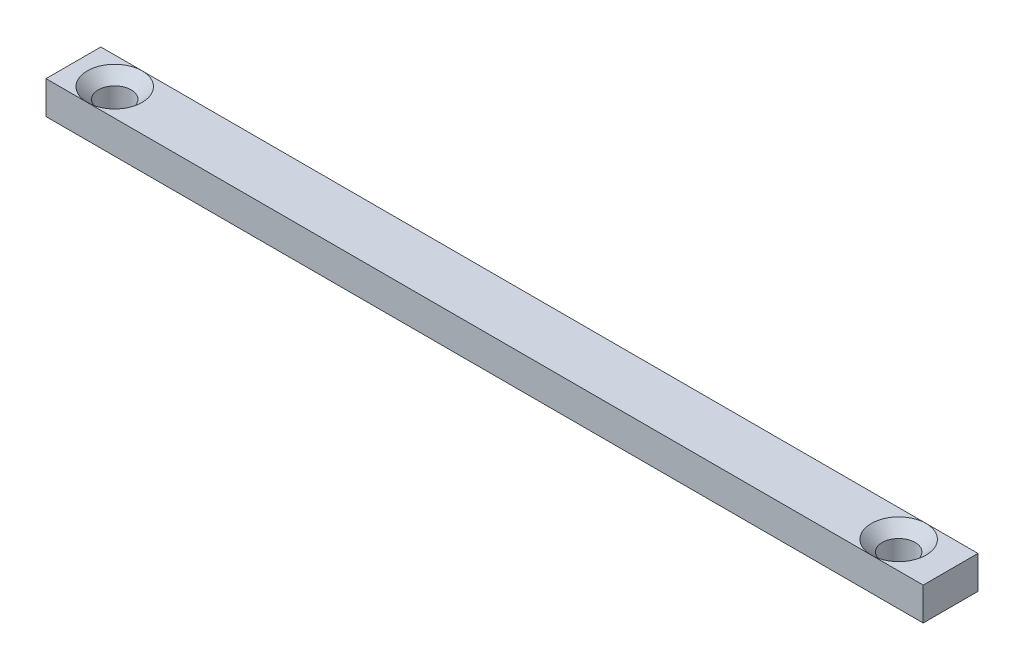
ISO-10303-21;
HEADER;
FILE_DESCRIPTION(('STEP AP214'),'2;1');
FILE_NAME('part.step','',(''),(''),'','','');
FILE_SCHEMA(('AUTOMOTIVE_DESIGN { 1 0 10303 214 1 1 1 1 }'));
ENDSEC;
DATA;
#1=APPLICATION_CONTEXT('core data for automotive mechanical design processes');
#2=APPLICATION_PROTOCOL_DEFINITION('international standard','automotive_design',2000,#1);
#3=PRODUCT_CONTEXT('',#1,'mechanical');
#4=PRODUCT('Part','Part','',(#3));
#5=PRODUCT_RELATED_PRODUCT_CATEGORY('part','',(#4));
#6=PRODUCT_DEFINITION_FORMATION('','',#4);
#7=PRODUCT_DEFINITION_CONTEXT('part definition',#1,'design');
#8=PRODUCT_DEFINITION('design','',#6,#7);
#9=PRODUCT_DEFINITION_SHAPE('','',#8);
#10=(LENGTH_UNIT() NAMED_UNIT(*) SI_UNIT(.MILLI.,.METRE.));
#11=(NAMED_UNIT(*) PLANE_ANGLE_UNIT() SI_UNIT($,.RADIAN.));
#12=(NAMED_UNIT(*) SI_UNIT($,.STERADIAN.) SOLID_ANGLE_UNIT());
#13=UNCERTAINTY_MEASURE_WITH_UNIT(LENGTH_MEASURE(1.E-05),#10,'distance_accuracy_value','');
#14=(GEOMETRIC_REPRESENTATION_CONTEXT(3) GLOBAL_UNCERTAINTY_ASSIGNED_CONTEXT((#13)) GLOBAL_UNIT_ASSIGNED_CONTEXT((#10,
#11,#12)) REPRESENTATION_CONTEXT('',''));
#15=CARTESIAN_POINT('',(0.,0.,0.));
#16=DIRECTION('',(0.,0.,1.));
#17=DIRECTION('',(1.,0.,0.));
#18=AXIS2_PLACEMENT_3D('',#15,#16,#17);
#19=CARTESIAN_POINT('',(0.,3.,0.));
#20=DIRECTION('',(0.,1.,0.));
#21=DIRECTION('',(0.,0.,1.));
#22=AXIS2_PLACEMENT_3D('',#19,#20,#21);
#23=PLANE('',#22);
#24=DIRECTION('',(1.,0.,0.));
#25=VECTOR('',#24,1.);
#26=CARTESIAN_POINT('',(-31.9743377483444,3.,-2.4192880794702));
#27=LINE('',#26,#25);
#28=CARTESIAN_POINT('',(-28.2081632060605,3.,-2.4192880794702));
#29=VERTEX_POINT('',#28);
#30=CARTESIAN_POINT('',(43.2918367939395,3.,-2.4192880794702));
#31=VERTEX_POINT('',#30);
#32=EDGE_CURVE('E117',#29,#31,#27,.T.);
#33=ORIENTED_EDGE('',*,*,#32,.T.);
#34=CARTESIAN_POINT('',(43.2918367939395,3.,-4.91928807947026));
#35=DIRECTION('',(0.,1.,0.));
#36=DIRECTION('',(0.,0.,1.));
#37=AXIS2_PLACEMENT_3D('',#34,#35,#36);
#38=CIRCLE('',#37,2.50000000000002);
#39=CARTESIAN_POINT('',(43.2918367939395,3.,-7.4192880794702));
#40=VERTEX_POINT('',#39);
#41=EDGE_CURVE('E63',#31,#40,#38,.F.);
#42=ORIENTED_EDGE('',*,*,#41,.T.);
#43=DIRECTION('',(-1.,0.,0.));
#44=VECTOR('',#43,1.);
#45=CARTESIAN_POINT('',(-31.9743377483444,3.,-7.4192880794702));
#46=LINE('',#45,#44);
#47=CARTESIAN_POINT('',(-28.2081632060605,3.,-7.4192880794702));
#48=VERTEX_POINT('',#47);
#49=EDGE_CURVE('E160',#40,#48,#46,.T.);
#50=ORIENTED_EDGE('',*,*,#49,.T.);
#51=CARTESIAN_POINT('',(-28.2081632060605,3.,-4.9192880794702));
#52=DIRECTION('',(0.,1.,0.));
#53=DIRECTION('',(0.,0.,1.));
#54=AXIS2_PLACEMENT_3D('',#51,#52,#53);
#55=CIRCLE('',#54,2.50000000000002);
#56=EDGE_CURVE('E69',#48,#29,#55,.F.);
#57=ORIENTED_EDGE('',*,*,#56,.T.);
#58=EDGE_LOOP('',(#33,#42,#50,#57));
#59=FACE_BOUND('',#58,.T.);
#60=ADVANCED_FACE('F53',(#59),#23,.T.);
#61=CARTESIAN_POINT('',(-31.9743377483444,3.,-2.4192880794702));
#62=VERTEX_POINT('',#61);
#63=EDGE_CURVE('E109',#62,#29,#27,.T.);
#64=ORIENTED_EDGE('',*,*,#63,.T.);
#65=CARTESIAN_POINT('',(-28.2081632060605,3.,-4.9192880794702));
#66=DIRECTION('',(0.,1.,0.));
#67=DIRECTION('',(0.,0.,1.));
#68=AXIS2_PLACEMENT_3D('',#65,#66,#67);
#69=CIRCLE('',#68,2.50000000000002);
#70=EDGE_CURVE('E152',#29,#48,#69,.F.);
#71=ORIENTED_EDGE('',*,*,#70,.T.);
#72=CARTESIAN_POINT('',(-31.9743377483444,3.,-7.4192880794702));
#73=VERTEX_POINT('',#72);
#74=EDGE_CURVE('E127',#48,#73,#46,.T.);
#75=ORIENTED_EDGE('',*,*,#74,.T.);
#76=DIRECTION('',(0.,0.,1.));
#77=VECTOR('',#76,1.);
#78=CARTESIAN_POINT('',(-31.9743377483444,3.,-7.4192880794702));
#79=LINE('',#78,#77);
#80=EDGE_CURVE('E124',#73,#62,#79,.T.);
#81=ORIENTED_EDGE('',*,*,#80,.T.);
#82=EDGE_LOOP('',(#64,#71,#75,#81));
#83=FACE_BOUND('',#82,.T.);
#84=ADVANCED_FACE('F125',(#83),#23,.T.);
#85=CARTESIAN_POINT('',(48.0256622516556,3.,-7.4192880794702));
#86=VERTEX_POINT('',#85);
#87=EDGE_CURVE('E166',#86,#40,#46,.T.);
#88=ORIENTED_EDGE('',*,*,#87,.T.);
#89=CARTESIAN_POINT('',(43.2918367939395,3.,-4.91928807947026));
#90=DIRECTION('',(0.,1.,0.));
#91=DIRECTION('',(0.,0.,1.));
#92=AXIS2_PLACEMENT_3D('',#89,#90,#91);
#93=CIRCLE('',#92,2.50000000000002);
#94=EDGE_CURVE('E76',#40,#31,#93,.F.);
#95=ORIENTED_EDGE('',*,*,#94,.T.);
#96=CARTESIAN_POINT('',(48.0256622516556,3.,-2.4192880794702));
#97=VERTEX_POINT('',#96);
#98=EDGE_CURVE('E122',#31,#97,#27,.T.);
#99=ORIENTED_EDGE('',*,*,#98,.T.);
#100=DIRECTION('',(0.,0.,-1.));
#101=VECTOR('',#100,1.);
#102=CARTESIAN_POINT('',(48.0256622516556,3.,-7.4192880794702));
#103=LINE('',#102,#101);
#104=EDGE_CURVE('E120',#97,#86,#103,.T.);
#105=ORIENTED_EDGE('',*,*,#104,.T.);
#106=EDGE_LOOP('',(#88,#95,#99,#105));
#107=FACE_BOUND('',#106,.T.);
#108=ADVANCED_FACE('F170',(#107),#23,.T.);
#109=CARTESIAN_POINT('',(0.,0.,0.));
#110=DIRECTION('',(0.,1.,0.));
#111=DIRECTION('',(0.,0.,1.));
#112=AXIS2_PLACEMENT_3D('',#109,#110,#111);
#113=PLANE('',#112);
#114=DIRECTION('',(0.,0.,1.));
#115=VECTOR('',#114,1.);
#116=CARTESIAN_POINT('',(-31.9743377483444,0.,-7.4192880794702));
#117=LINE('',#116,#115);
#118=CARTESIAN_POINT('',(-31.9743377483444,0.,-7.4192880794702));
#119=VERTEX_POINT('',#118);
#120=CARTESIAN_POINT('',(-31.9743377483444,0.,-2.4192880794702));
#121=VERTEX_POINT('',#120);
#122=EDGE_CURVE('E136',#119,#121,#117,.T.);
#123=ORIENTED_EDGE('',*,*,#122,.F.);
#124=DIRECTION('',(-1.,0.,0.));
#125=VECTOR('',#124,1.);
#126=CARTESIAN_POINT('',(-31.9743377483444,0.,-7.4192880794702));
#127=LINE('',#126,#125);
#128=CARTESIAN_POINT('',(48.0256622516556,0.,-7.4192880794702));
#129=VERTEX_POINT('',#128);
#130=EDGE_CURVE('E132',#129,#119,#127,.T.);
#131=ORIENTED_EDGE('',*,*,#130,.F.);
#132=DIRECTION('',(0.,0.,-1.));
#133=VECTOR('',#132,1.);
#134=CARTESIAN_POINT('',(48.0256622516556,0.,-7.4192880794702));
#135=LINE('',#134,#133);
#136=CARTESIAN_POINT('',(48.0256622516556,0.,-2.4192880794702));
#137=VERTEX_POINT('',#136);
#138=EDGE_CURVE('E304',#137,#129,#135,.T.);
#139=ORIENTED_EDGE('',*,*,#138,.F.);
#140=DIRECTION('',(1.,0.,0.));
#141=VECTOR('',#140,1.);
#142=CARTESIAN_POINT('',(-31.9743377483444,0.,-2.4192880794702));
#143=LINE('',#142,#141);
#144=EDGE_CURVE('E308',#121,#137,#143,.T.);
#145=ORIENTED_EDGE('',*,*,#144,.F.);
#146=EDGE_LOOP('',(#123,#131,#139,#145));
#147=FACE_BOUND('',#146,.T.);
#148=CARTESIAN_POINT('',(-28.2081632060605,0.,-4.9192880794702));
#149=DIRECTION('',(0.,1.,0.));
#150=DIRECTION('',(0.,0.,1.));
#151=AXIS2_PLACEMENT_3D('',#148,#149,#150);
#152=CIRCLE('',#151,1.5);
#153=CARTESIAN_POINT('',(-28.2081632060605,0.,-3.4192880794702));
#154=VERTEX_POINT('',#153);
#155=EDGE_CURVE('E182',#154,#154,#152,.T.);
#156=ORIENTED_EDGE('',*,*,#155,.T.);
#157=EDGE_LOOP('',(#156));
#158=FACE_BOUND('',#157,.T.);
#159=CARTESIAN_POINT('',(43.2918367939395,0.,-4.91928807947026));
#160=DIRECTION('',(0.,1.,0.));
#161=DIRECTION('',(0.,0.,1.));
#162=AXIS2_PLACEMENT_3D('',#159,#160,#161);
#163=CIRCLE('',#162,1.5);
#164=CARTESIAN_POINT('',(43.2918367939395,0.,-3.41928807947026));
#165=VERTEX_POINT('',#164);
#166=EDGE_CURVE('E186',#165,#165,#163,.T.);
#167=ORIENTED_EDGE('',*,*,#166,.T.);
#168=EDGE_LOOP('',(#167));
#169=FACE_BOUND('',#168,.T.);
#170=ADVANCED_FACE('F191',(#147,#158,#169),#113,.F.);
#171=CARTESIAN_POINT('',(-31.9743377483444,3.,-7.4192880794702));
#172=DIRECTION('',(1.,0.,0.));
#173=DIRECTION('',(0.,0.,-1.));
#174=AXIS2_PLACEMENT_3D('',#171,#172,#173);
#175=PLANE('',#174);
#176=ORIENTED_EDGE('',*,*,#122,.T.);
#177=DIRECTION('',(0.,-1.,0.));
#178=VECTOR('',#177,1.);
#179=CARTESIAN_POINT('',(-31.9743377483444,3.,-2.4192880794702));
#180=LINE('',#179,#178);
#181=EDGE_CURVE('E113',#62,#121,#180,.T.);
#182=ORIENTED_EDGE('',*,*,#181,.F.);
#183=ORIENTED_EDGE('',*,*,#80,.F.);
#184=DIRECTION('',(0.,-1.,0.));
#185=VECTOR('',#184,1.);
#186=CARTESIAN_POINT('',(-31.9743377483444,3.,-7.4192880794702));
#187=LINE('',#186,#185);
#188=EDGE_CURVE('E174',#73,#119,#187,.T.);
#189=ORIENTED_EDGE('',*,*,#188,.T.);
#190=EDGE_LOOP('',(#176,#182,#183,#189));
#191=FACE_BOUND('',#190,.T.);
#192=ADVANCED_FACE('F134',(#191),#175,.F.);
#193=CARTESIAN_POINT('',(-31.9743377483444,3.,-2.4192880794702));
#194=DIRECTION('',(0.,0.,-1.));
#195=DIRECTION('',(-1.,0.,0.));
#196=AXIS2_PLACEMENT_3D('',#193,#194,#195);
#197=PLANE('',#196);
#198=ORIENTED_EDGE('',*,*,#144,.T.);
#199=DIRECTION('',(0.,-1.,0.));
#200=VECTOR('',#199,1.);
#201=CARTESIAN_POINT('',(48.0256622516556,3.,-2.4192880794702));
#202=LINE('',#201,#200);
#203=EDGE_CURVE('E139',#97,#137,#202,.T.);
#204=ORIENTED_EDGE('',*,*,#203,.F.);
#205=ORIENTED_EDGE('',*,*,#98,.F.);
#206=ORIENTED_EDGE('',*,*,#32,.F.);
#207=ORIENTED_EDGE('',*,*,#63,.F.);
#208=ORIENTED_EDGE('',*,*,#181,.T.);
#209=EDGE_LOOP('',(#198,#204,#205,#206,#207,#208));
#210=FACE_BOUND('',#209,.T.);
#211=ADVANCED_FACE('F111',(#210),#197,.F.);
#212=CARTESIAN_POINT('',(48.0256622516556,3.,-7.4192880794702));
#213=DIRECTION('',(-1.,0.,0.));
#214=DIRECTION('',(0.,0.,1.));
#215=AXIS2_PLACEMENT_3D('',#212,#213,#214);
#216=PLANE('',#215);
#217=ORIENTED_EDGE('',*,*,#138,.T.);
#218=DIRECTION('',(0.,-1.,0.));
#219=VECTOR('',#218,1.);
#220=CARTESIAN_POINT('',(48.0256622516556,3.,-7.4192880794702));
#221=LINE('',#220,#219);
#222=EDGE_CURVE('E146',#86,#129,#221,.T.);
#223=ORIENTED_EDGE('',*,*,#222,.F.);
#224=ORIENTED_EDGE('',*,*,#104,.F.);
#225=ORIENTED_EDGE('',*,*,#203,.T.);
#226=EDGE_LOOP('',(#217,#223,#224,#225));
#227=FACE_BOUND('',#226,.T.);
#228=ADVANCED_FACE('F224',(#227),#216,.F.);
#229=CARTESIAN_POINT('',(-31.9743377483444,3.,-7.4192880794702));
#230=DIRECTION('',(0.,0.,1.));
#231=DIRECTION('',(1.,0.,0.));
#232=AXIS2_PLACEMENT_3D('',#229,#230,#231);
#233=PLANE('',#232);
#234=ORIENTED_EDGE('',*,*,#130,.T.);
#235=ORIENTED_EDGE('',*,*,#188,.F.);
#236=ORIENTED_EDGE('',*,*,#74,.F.);
#237=ORIENTED_EDGE('',*,*,#49,.F.);
#238=ORIENTED_EDGE('',*,*,#87,.F.);
#239=ORIENTED_EDGE('',*,*,#222,.T.);
#240=EDGE_LOOP('',(#234,#235,#236,#237,#238,#239));
#241=FACE_BOUND('',#240,.T.);
#242=ADVANCED_FACE('F164',(#241),#233,.F.);
#243=CARTESIAN_POINT('',(-28.2081632060605,3.,-4.9192880794702));
#244=DIRECTION('',(0.,-1.,0.));
#245=DIRECTION('',(0.,0.,-1.));
#246=AXIS2_PLACEMENT_3D('',#243,#244,#245);
#247=CYLINDRICAL_SURFACE('',#246,1.5);
#248=CARTESIAN_POINT('',(-28.2081632060605,1.99999999999999,-4.9192880794702));
#249=DIRECTION('',(0.,1.,0.));
#250=DIRECTION('',(0.,0.,1.));
#251=AXIS2_PLACEMENT_3D('',#248,#249,#250);
#252=CIRCLE('',#251,1.5);
#253=CARTESIAN_POINT('',(-28.2081632060605,1.99999999999999,-3.4192880794702));
#254=VERTEX_POINT('',#253);
#255=EDGE_CURVE('E13',#254,#254,#252,.T.);
#256=ORIENTED_EDGE('',*,*,#255,.T.);
#257=EDGE_LOOP('',(#256));
#258=FACE_BOUND('',#257,.T.);
#259=ORIENTED_EDGE('',*,*,#155,.F.);
#260=EDGE_LOOP('',(#259));
#261=FACE_BOUND('',#260,.T.);
#262=ADVANCED_FACE('F196',(#258,#261),#247,.F.);
#263=CARTESIAN_POINT('',(43.2918367939395,3.,-4.91928807947026));
#264=DIRECTION('',(0.,-1.,0.));
#265=DIRECTION('',(0.,0.,-1.));
#266=AXIS2_PLACEMENT_3D('',#263,#264,#265);
#267=CYLINDRICAL_SURFACE('',#266,1.5);
#268=CARTESIAN_POINT('',(43.2918367939395,1.99999999999999,-4.91928807947026));
#269=DIRECTION('',(0.,1.,0.));
#270=DIRECTION('',(0.,0.,1.));
#271=AXIS2_PLACEMENT_3D('',#268,#269,#270);
#272=CIRCLE('',#271,1.5);
#273=CARTESIAN_POINT('',(43.2918367939395,1.99999999999999,-3.41928807947026));
#274=VERTEX_POINT('',#273);
#275=EDGE_CURVE('E138',#274,#274,#272,.T.);
#276=ORIENTED_EDGE('',*,*,#275,.T.);
#277=EDGE_LOOP('',(#276));
#278=FACE_BOUND('',#277,.T.);
#279=ORIENTED_EDGE('',*,*,#166,.F.);
#280=EDGE_LOOP('',(#279));
#281=FACE_BOUND('',#280,.T.);
#282=ADVANCED_FACE('F193',(#278,#281),#267,.F.);
#283=CARTESIAN_POINT('',(43.2918367939395,1.99999999999999,-4.91928807947026));
#284=DIRECTION('',(0.,1.,0.));
#285=DIRECTION('',(0.,0.,1.));
#286=AXIS2_PLACEMENT_3D('',#283,#284,#285);
#287=CONICAL_SURFACE('',#286,1.5,0.785398163397449);
#288=ORIENTED_EDGE('',*,*,#94,.F.);
#289=ORIENTED_EDGE('',*,*,#41,.F.);
#290=EDGE_LOOP('',(#288,#289));
#291=FACE_BOUND('',#290,.T.);
#292=ORIENTED_EDGE('',*,*,#275,.F.);
#293=EDGE_LOOP('',(#292));
#294=FACE_BOUND('',#293,.T.);
#295=ADVANCED_FACE('F195',(#291,#294),#287,.F.);
#296=CARTESIAN_POINT('',(-28.2081632060605,1.99999999999999,-4.9192880794702));
#297=DIRECTION('',(0.,1.,0.));
#298=DIRECTION('',(0.,0.,1.));
#299=AXIS2_PLACEMENT_3D('',#296,#297,#298);
#300=CONICAL_SURFACE('',#299,1.5,0.785398163397449);
#301=ORIENTED_EDGE('',*,*,#56,.F.);
#302=ORIENTED_EDGE('',*,*,#70,.F.);
#303=EDGE_LOOP('',(#301,#302));
#304=FACE_BOUND('',#303,.T.);
#305=ORIENTED_EDGE('',*,*,#255,.F.);
#306=EDGE_LOOP('',(#305));
#307=FACE_BOUND('',#306,.T.);
#308=ADVANCED_FACE('F56',(#304,#307),#300,.F.);
#309=CLOSED_SHELL('',(#60,#84,#108,#170,#192,#211,#228,#242,#262,#282,#295,#308));
#310=MANIFOLD_SOLID_BREP('B2',#309);
#311=ADVANCED_BREP_SHAPE_REPRESENTATION('',(#18,#310),#14);
#312=SHAPE_DEFINITION_REPRESENTATION(#9,#311);
ENDSEC;
END-ISO-10303-21;
